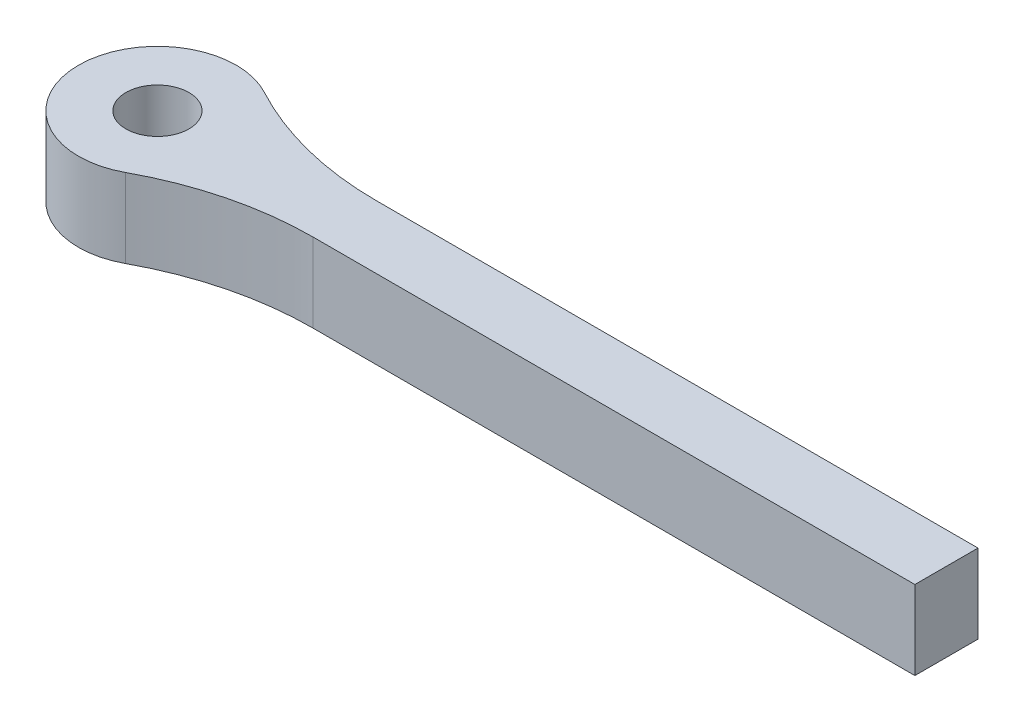
ISO-10303-21;
HEADER;
FILE_DESCRIPTION(('STEP AP214'),'2;1');
FILE_NAME('part.step','',(''),(''),'','','');
FILE_SCHEMA(('AUTOMOTIVE_DESIGN { 1 0 10303 214 1 1 1 1 }'));
ENDSEC;
DATA;
#1=APPLICATION_CONTEXT('core data for automotive mechanical design processes');
#2=APPLICATION_PROTOCOL_DEFINITION('international standard','automotive_design',2000,#1);
#3=PRODUCT_CONTEXT('',#1,'mechanical');
#4=PRODUCT('Part','Part','',(#3));
#5=PRODUCT_RELATED_PRODUCT_CATEGORY('part','',(#4));
#6=PRODUCT_DEFINITION_FORMATION('','',#4);
#7=PRODUCT_DEFINITION_CONTEXT('part definition',#1,'design');
#8=PRODUCT_DEFINITION('design','',#6,#7);
#9=PRODUCT_DEFINITION_SHAPE('','',#8);
#10=(LENGTH_UNIT() NAMED_UNIT(*) SI_UNIT(.MILLI.,.METRE.));
#11=(NAMED_UNIT(*) PLANE_ANGLE_UNIT() SI_UNIT($,.RADIAN.));
#12=(NAMED_UNIT(*) SI_UNIT($,.STERADIAN.) SOLID_ANGLE_UNIT());
#13=UNCERTAINTY_MEASURE_WITH_UNIT(LENGTH_MEASURE(1.E-05),#10,'distance_accuracy_value','');
#14=(GEOMETRIC_REPRESENTATION_CONTEXT(3) GLOBAL_UNCERTAINTY_ASSIGNED_CONTEXT((#13)) GLOBAL_UNIT_ASSIGNED_CONTEXT((#10,
#11,#12)) REPRESENTATION_CONTEXT('',''));
#15=CARTESIAN_POINT('',(0.,0.,0.));
#16=DIRECTION('',(0.,0.,1.));
#17=DIRECTION('',(1.,0.,0.));
#18=AXIS2_PLACEMENT_3D('',#15,#16,#17);
#19=CARTESIAN_POINT('',(-58.1914893617021,7.5,-0.553191489361701));
#20=DIRECTION('',(0.,-1.,0.));
#21=DIRECTION('',(0.,0.,-1.));
#22=AXIS2_PLACEMENT_3D('',#19,#20,#21);
#23=CYLINDRICAL_SURFACE('',#22,7.5);
#24=CARTESIAN_POINT('',(-58.1914893617021,7.5,-0.553191489361701));
#25=DIRECTION('',(0.,1.,0.));
#26=DIRECTION('',(0.,0.,1.));
#27=AXIS2_PLACEMENT_3D('',#24,#25,#26);
#28=CIRCLE('',#27,7.5);
#29=CARTESIAN_POINT('',(-54.6291867355908,7.5,-7.1531914893617));
#30=VERTEX_POINT('',#29);
#31=CARTESIAN_POINT('',(-54.6291867355908,7.5,6.0468085106383));
#32=VERTEX_POINT('',#31);
#33=EDGE_CURVE('E104',#30,#32,#28,.T.);
#34=ORIENTED_EDGE('',*,*,#33,.F.);
#35=DIRECTION('',(0.,-1.,0.));
#36=VECTOR('',#35,1.);
#37=CARTESIAN_POINT('',(-54.6291867355908,7.5,-7.1531914893617));
#38=LINE('',#37,#36);
#39=CARTESIAN_POINT('',(-54.6291867355908,0.,-7.1531914893617));
#40=VERTEX_POINT('',#39);
#41=EDGE_CURVE('E161',#30,#40,#38,.T.);
#42=ORIENTED_EDGE('',*,*,#41,.T.);
#43=CARTESIAN_POINT('',(-58.1914893617021,0.,-0.553191489361701));
#44=DIRECTION('',(0.,1.,0.));
#45=DIRECTION('',(0.,0.,1.));
#46=AXIS2_PLACEMENT_3D('',#43,#44,#45);
#47=CIRCLE('',#46,7.5);
#48=CARTESIAN_POINT('',(-54.6291867355908,0.,6.0468085106383));
#49=VERTEX_POINT('',#48);
#50=EDGE_CURVE('E132',#40,#49,#47,.T.);
#51=ORIENTED_EDGE('',*,*,#50,.T.);
#52=DIRECTION('',(0.,-1.,0.));
#53=VECTOR('',#52,1.);
#54=CARTESIAN_POINT('',(-54.6291867355908,7.5,6.0468085106383));
#55=LINE('',#54,#53);
#56=EDGE_CURVE('E151',#49,#32,#55,.F.);
#57=ORIENTED_EDGE('',*,*,#56,.T.);
#58=EDGE_LOOP('',(#34,#42,#51,#57));
#59=FACE_BOUND('',#58,.T.);
#60=ADVANCED_FACE('F40',(#59),#23,.T.);
#61=CARTESIAN_POINT('',(0.,7.5,2.4468085106383));
#62=DIRECTION('',(0.,0.,-1.));
#63=DIRECTION('',(-1.,0.,0.));
#64=AXIS2_PLACEMENT_3D('',#61,#62,#63);
#65=PLANE('',#64);
#66=DIRECTION('',(1.,0.,0.));
#67=VECTOR('',#66,1.);
#68=CARTESIAN_POINT('',(0.,7.5,2.4468085106383));
#69=LINE('',#68,#67);
#70=CARTESIAN_POINT('',(-40.3799762311453,7.5,2.4468085106383));
#71=VERTEX_POINT('',#70);
#72=CARTESIAN_POINT('',(16.8085106382979,7.5,2.4468085106383));
#73=VERTEX_POINT('',#72);
#74=EDGE_CURVE('E92',#71,#73,#69,.T.);
#75=ORIENTED_EDGE('',*,*,#74,.F.);
#76=DIRECTION('',(0.,1.,0.));
#77=VECTOR('',#76,1.);
#78=CARTESIAN_POINT('',(-40.3799762311453,0.,2.4468085106383));
#79=LINE('',#78,#77);
#80=CARTESIAN_POINT('',(-40.3799762311453,0.,2.4468085106383));
#81=VERTEX_POINT('',#80);
#82=EDGE_CURVE('E115',#71,#81,#79,.F.);
#83=ORIENTED_EDGE('',*,*,#82,.T.);
#84=DIRECTION('',(1.,0.,0.));
#85=VECTOR('',#84,1.);
#86=CARTESIAN_POINT('',(0.,0.,2.4468085106383));
#87=LINE('',#86,#85);
#88=CARTESIAN_POINT('',(16.8085106382979,0.,2.4468085106383));
#89=VERTEX_POINT('',#88);
#90=EDGE_CURVE('E110',#81,#89,#87,.T.);
#91=ORIENTED_EDGE('',*,*,#90,.T.);
#92=DIRECTION('',(0.,-1.,0.));
#93=VECTOR('',#92,1.);
#94=CARTESIAN_POINT('',(16.8085106382979,7.5,2.4468085106383));
#95=LINE('',#94,#93);
#96=EDGE_CURVE('E107',#73,#89,#95,.T.);
#97=ORIENTED_EDGE('',*,*,#96,.F.);
#98=EDGE_LOOP('',(#75,#83,#91,#97));
#99=FACE_BOUND('',#98,.T.);
#100=ADVANCED_FACE('F108',(#99),#65,.F.);
#101=CARTESIAN_POINT('',(16.8085106382979,7.5,0.));
#102=DIRECTION('',(1.,0.,0.));
#103=DIRECTION('',(0.,0.,-1.));
#104=AXIS2_PLACEMENT_3D('',#101,#102,#103);
#105=PLANE('',#104);
#106=DIRECTION('',(0.,0.,1.));
#107=VECTOR('',#106,1.);
#108=CARTESIAN_POINT('',(16.8085106382979,0.,0.));
#109=LINE('',#108,#107);
#110=CARTESIAN_POINT('',(16.8085106382979,0.,-3.5531914893617));
#111=VERTEX_POINT('',#110);
#112=EDGE_CURVE('E137',#111,#89,#109,.T.);
#113=ORIENTED_EDGE('',*,*,#112,.F.);
#114=DIRECTION('',(0.,-1.,0.));
#115=VECTOR('',#114,1.);
#116=CARTESIAN_POINT('',(16.8085106382979,7.5,-3.5531914893617));
#117=LINE('',#116,#115);
#118=CARTESIAN_POINT('',(16.8085106382979,7.5,-3.5531914893617));
#119=VERTEX_POINT('',#118);
#120=EDGE_CURVE('E116',#119,#111,#117,.T.);
#121=ORIENTED_EDGE('',*,*,#120,.F.);
#122=DIRECTION('',(0.,0.,1.));
#123=VECTOR('',#122,1.);
#124=CARTESIAN_POINT('',(16.8085106382979,7.5,0.));
#125=LINE('',#124,#123);
#126=EDGE_CURVE('E97',#119,#73,#125,.T.);
#127=ORIENTED_EDGE('',*,*,#126,.T.);
#128=ORIENTED_EDGE('',*,*,#96,.T.);
#129=EDGE_LOOP('',(#113,#121,#127,#128));
#130=FACE_BOUND('',#129,.T.);
#131=ADVANCED_FACE('F119',(#130),#105,.T.);
#132=CARTESIAN_POINT('',(0.,7.5,-3.5531914893617));
#133=DIRECTION('',(0.,0.,-1.));
#134=DIRECTION('',(-1.,0.,0.));
#135=AXIS2_PLACEMENT_3D('',#132,#133,#134);
#136=PLANE('',#135);
#137=DIRECTION('',(1.,0.,0.));
#138=VECTOR('',#137,1.);
#139=CARTESIAN_POINT('',(0.,0.,-3.5531914893617));
#140=LINE('',#139,#138);
#141=CARTESIAN_POINT('',(-40.3799762311453,0.,-3.5531914893617));
#142=VERTEX_POINT('',#141);
#143=EDGE_CURVE('E140',#142,#111,#140,.T.);
#144=ORIENTED_EDGE('',*,*,#143,.F.);
#145=DIRECTION('',(0.,-1.,0.));
#146=VECTOR('',#145,1.);
#147=CARTESIAN_POINT('',(-40.3799762311453,7.5,-3.5531914893617));
#148=LINE('',#147,#146);
#149=CARTESIAN_POINT('',(-40.3799762311453,7.5,-3.5531914893617));
#150=VERTEX_POINT('',#149);
#151=EDGE_CURVE('E56',#142,#150,#148,.F.);
#152=ORIENTED_EDGE('',*,*,#151,.T.);
#153=DIRECTION('',(1.,0.,0.));
#154=VECTOR('',#153,1.);
#155=CARTESIAN_POINT('',(0.,7.5,-3.5531914893617));
#156=LINE('',#155,#154);
#157=EDGE_CURVE('E122',#150,#119,#156,.T.);
#158=ORIENTED_EDGE('',*,*,#157,.T.);
#159=ORIENTED_EDGE('',*,*,#120,.T.);
#160=EDGE_LOOP('',(#144,#152,#158,#159));
#161=FACE_BOUND('',#160,.T.);
#162=ADVANCED_FACE('F194',(#161),#136,.T.);
#163=CARTESIAN_POINT('',(-58.1914893617021,7.5,-0.553191489361701));
#164=DIRECTION('',(0.,-1.,0.));
#165=DIRECTION('',(0.,0.,-1.));
#166=AXIS2_PLACEMENT_3D('',#163,#164,#165);
#167=CYLINDRICAL_SURFACE('',#166,3.);
#168=CARTESIAN_POINT('',(-58.1914893617021,7.5,-0.553191489361701));
#169=DIRECTION('',(0.,1.,0.));
#170=DIRECTION('',(0.,0.,1.));
#171=AXIS2_PLACEMENT_3D('',#168,#169,#170);
#172=CIRCLE('',#171,3.);
#173=CARTESIAN_POINT('',(-58.1914893617021,7.5,2.4468085106383));
#174=VERTEX_POINT('',#173);
#175=EDGE_CURVE('E125',#174,#174,#172,.T.);
#176=ORIENTED_EDGE('',*,*,#175,.T.);
#177=EDGE_LOOP('',(#176));
#178=FACE_BOUND('',#177,.T.);
#179=CARTESIAN_POINT('',(-58.1914893617021,0.,-0.553191489361701));
#180=DIRECTION('',(0.,1.,0.));
#181=DIRECTION('',(0.,0.,1.));
#182=AXIS2_PLACEMENT_3D('',#179,#180,#181);
#183=CIRCLE('',#182,3.);
#184=CARTESIAN_POINT('',(-58.1914893617021,0.,2.4468085106383));
#185=VERTEX_POINT('',#184);
#186=EDGE_CURVE('E143',#185,#185,#183,.T.);
#187=ORIENTED_EDGE('',*,*,#186,.F.);
#188=EDGE_LOOP('',(#187));
#189=FACE_BOUND('',#188,.T.);
#190=ADVANCED_FACE('F196',(#178,#189),#167,.F.);
#191=CARTESIAN_POINT('',(0.,7.5,0.));
#192=DIRECTION('',(0.,1.,0.));
#193=DIRECTION('',(0.,0.,1.));
#194=AXIS2_PLACEMENT_3D('',#191,#192,#193);
#195=PLANE('',#194);
#196=ORIENTED_EDGE('',*,*,#157,.F.);
#197=CARTESIAN_POINT('',(-40.3799762311453,7.5,-33.5531914893617));
#198=DIRECTION('',(0.,1.,0.));
#199=DIRECTION('',(0.,0.,1.));
#200=AXIS2_PLACEMENT_3D('',#197,#198,#199);
#201=CIRCLE('',#200,30.);
#202=EDGE_CURVE('E11',#150,#30,#201,.F.);
#203=ORIENTED_EDGE('',*,*,#202,.T.);
#204=ORIENTED_EDGE('',*,*,#33,.T.);
#205=CARTESIAN_POINT('',(-40.3799762311453,7.5,32.4468085106383));
#206=DIRECTION('',(0.,1.,0.));
#207=DIRECTION('',(0.,0.,1.));
#208=AXIS2_PLACEMENT_3D('',#205,#206,#207);
#209=CIRCLE('',#208,30.);
#210=EDGE_CURVE('E99',#32,#71,#209,.F.);
#211=ORIENTED_EDGE('',*,*,#210,.T.);
#212=ORIENTED_EDGE('',*,*,#74,.T.);
#213=ORIENTED_EDGE('',*,*,#126,.F.);
#214=EDGE_LOOP('',(#196,#203,#204,#211,#212,#213));
#215=FACE_BOUND('',#214,.T.);
#216=ORIENTED_EDGE('',*,*,#175,.F.);
#217=EDGE_LOOP('',(#216));
#218=FACE_BOUND('',#217,.T.);
#219=ADVANCED_FACE('F94',(#215,#218),#195,.T.);
#220=CARTESIAN_POINT('',(0.,0.,0.));
#221=DIRECTION('',(0.,1.,0.));
#222=DIRECTION('',(0.,0.,1.));
#223=AXIS2_PLACEMENT_3D('',#220,#221,#222);
#224=PLANE('',#223);
#225=ORIENTED_EDGE('',*,*,#50,.F.);
#226=CARTESIAN_POINT('',(-40.3799762311453,0.,-33.5531914893617));
#227=DIRECTION('',(0.,1.,0.));
#228=DIRECTION('',(0.,0.,1.));
#229=AXIS2_PLACEMENT_3D('',#226,#227,#228);
#230=CIRCLE('',#229,30.);
#231=EDGE_CURVE('E49',#40,#142,#230,.T.);
#232=ORIENTED_EDGE('',*,*,#231,.T.);
#233=ORIENTED_EDGE('',*,*,#143,.T.);
#234=ORIENTED_EDGE('',*,*,#112,.T.);
#235=ORIENTED_EDGE('',*,*,#90,.F.);
#236=CARTESIAN_POINT('',(-40.3799762311453,0.,32.4468085106383));
#237=DIRECTION('',(0.,1.,0.));
#238=DIRECTION('',(0.,0.,1.));
#239=AXIS2_PLACEMENT_3D('',#236,#237,#238);
#240=CIRCLE('',#239,30.);
#241=EDGE_CURVE('E155',#81,#49,#240,.T.);
#242=ORIENTED_EDGE('',*,*,#241,.T.);
#243=EDGE_LOOP('',(#225,#232,#233,#234,#235,#242));
#244=FACE_BOUND('',#243,.T.);
#245=ORIENTED_EDGE('',*,*,#186,.T.);
#246=EDGE_LOOP('',(#245));
#247=FACE_BOUND('',#246,.T.);
#248=ADVANCED_FACE('F172',(#244,#247),#224,.F.);
#249=CARTESIAN_POINT('',(-40.3799762311453,7.5,32.4468085106383));
#250=DIRECTION('',(0.,-1.,0.));
#251=DIRECTION('',(0.,0.,-1.));
#252=AXIS2_PLACEMENT_3D('',#249,#250,#251);
#253=CYLINDRICAL_SURFACE('',#252,30.);
#254=ORIENTED_EDGE('',*,*,#210,.F.);
#255=ORIENTED_EDGE('',*,*,#56,.F.);
#256=ORIENTED_EDGE('',*,*,#241,.F.);
#257=ORIENTED_EDGE('',*,*,#82,.F.);
#258=EDGE_LOOP('',(#254,#255,#256,#257));
#259=FACE_BOUND('',#258,.T.);
#260=ADVANCED_FACE('F176',(#259),#253,.F.);
#261=CARTESIAN_POINT('',(-40.3799762311453,7.5,-33.5531914893617));
#262=DIRECTION('',(0.,-1.,0.));
#263=DIRECTION('',(0.,0.,-1.));
#264=AXIS2_PLACEMENT_3D('',#261,#262,#263);
#265=CYLINDRICAL_SURFACE('',#264,30.);
#266=ORIENTED_EDGE('',*,*,#202,.F.);
#267=ORIENTED_EDGE('',*,*,#151,.F.);
#268=ORIENTED_EDGE('',*,*,#231,.F.);
#269=ORIENTED_EDGE('',*,*,#41,.F.);
#270=EDGE_LOOP('',(#266,#267,#268,#269));
#271=FACE_BOUND('',#270,.T.);
#272=ADVANCED_FACE('F42',(#271),#265,.F.);
#273=CLOSED_SHELL('',(#60,#100,#131,#162,#190,#219,#248,#260,#272));
#274=MANIFOLD_SOLID_BREP('B2',#273);
#275=ADVANCED_BREP_SHAPE_REPRESENTATION('',(#18,#274),#14);
#276=SHAPE_DEFINITION_REPRESENTATION(#9,#275);
ENDSEC;
END-ISO-10303-21;
